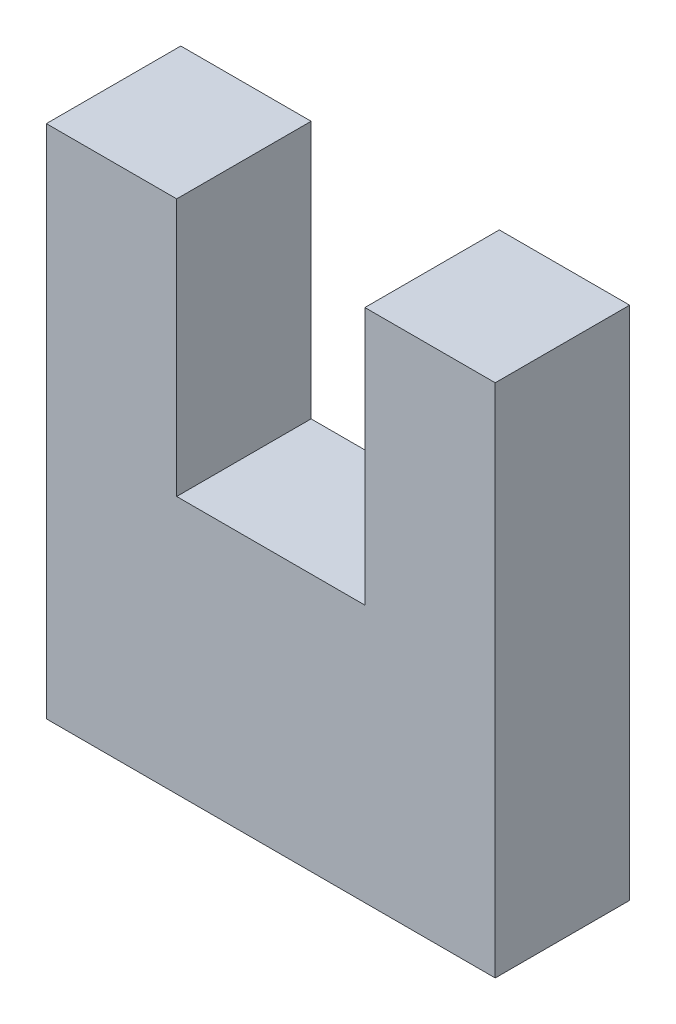
ISO-10303-21;
HEADER;
FILE_DESCRIPTION(('STEP AP214'),'2;1');
FILE_NAME('part.step','',(''),(''),'','','');
FILE_SCHEMA(('AUTOMOTIVE_DESIGN { 1 0 10303 214 1 1 1 1 }'));
ENDSEC;
DATA;
#1=APPLICATION_CONTEXT('core data for automotive mechanical design processes');
#2=APPLICATION_PROTOCOL_DEFINITION('international standard','automotive_design',2000,#1);
#3=PRODUCT_CONTEXT('',#1,'mechanical');
#4=PRODUCT('Part','Part','',(#3));
#5=PRODUCT_RELATED_PRODUCT_CATEGORY('part','',(#4));
#6=PRODUCT_DEFINITION_FORMATION('','',#4);
#7=PRODUCT_DEFINITION_CONTEXT('part definition',#1,'design');
#8=PRODUCT_DEFINITION('design','',#6,#7);
#9=PRODUCT_DEFINITION_SHAPE('','',#8);
#10=(LENGTH_UNIT() NAMED_UNIT(*) SI_UNIT(.MILLI.,.METRE.));
#11=(NAMED_UNIT(*) PLANE_ANGLE_UNIT() SI_UNIT($,.RADIAN.));
#12=(NAMED_UNIT(*) SI_UNIT($,.STERADIAN.) SOLID_ANGLE_UNIT());
#13=UNCERTAINTY_MEASURE_WITH_UNIT(LENGTH_MEASURE(1.E-05),#10,'distance_accuracy_value','');
#14=(GEOMETRIC_REPRESENTATION_CONTEXT(3) GLOBAL_UNCERTAINTY_ASSIGNED_CONTEXT((#13)) GLOBAL_UNIT_ASSIGNED_CONTEXT((#10,
#11,#12)) REPRESENTATION_CONTEXT('',''));
#15=CARTESIAN_POINT('',(0.,0.,0.));
#16=DIRECTION('',(0.,0.,1.));
#17=DIRECTION('',(1.,0.,0.));
#18=AXIS2_PLACEMENT_3D('',#15,#16,#17);
#19=CARTESIAN_POINT('',(0.,16.8021,0.));
#20=DIRECTION('',(0.,-1.,0.));
#21=DIRECTION('',(0.,0.,-1.));
#22=AXIS2_PLACEMENT_3D('',#19,#20,#21);
#23=PLANE('',#22);
#24=DIRECTION('',(0.,0.,1.));
#25=VECTOR('',#24,1.);
#26=CARTESIAN_POINT('',(20.7645,16.8021,-8.763));
#27=LINE('',#26,#25);
#28=CARTESIAN_POINT('',(20.7645,16.8021,-8.763));
#29=VERTEX_POINT('',#28);
#30=CARTESIAN_POINT('',(20.7645,16.8021,0.));
#31=VERTEX_POINT('',#30);
#32=EDGE_CURVE('E122',#29,#31,#27,.T.);
#33=ORIENTED_EDGE('',*,*,#32,.F.);
#34=DIRECTION('',(-1.,0.,0.));
#35=VECTOR('',#34,1.);
#36=CARTESIAN_POINT('',(0.,16.8021,-8.763));
#37=LINE('',#36,#35);
#38=CARTESIAN_POINT('',(8.49629999999999,16.8021,-8.763));
#39=VERTEX_POINT('',#38);
#40=EDGE_CURVE('E150',#29,#39,#37,.T.);
#41=ORIENTED_EDGE('',*,*,#40,.T.);
#42=DIRECTION('',(0.,0.,-1.));
#43=VECTOR('',#42,1.);
#44=CARTESIAN_POINT('',(8.49629999999999,16.8021,-8.763));
#45=LINE('',#44,#43);
#46=CARTESIAN_POINT('',(8.4963,16.8021,0.));
#47=VERTEX_POINT('',#46);
#48=EDGE_CURVE('E59',#47,#39,#45,.T.);
#49=ORIENTED_EDGE('',*,*,#48,.F.);
#50=DIRECTION('',(1.,0.,0.));
#51=VECTOR('',#50,1.);
#52=CARTESIAN_POINT('',(0.,16.8021,0.));
#53=LINE('',#52,#51);
#54=EDGE_CURVE('E54',#47,#31,#53,.T.);
#55=ORIENTED_EDGE('',*,*,#54,.T.);
#56=EDGE_LOOP('',(#33,#41,#49,#55));
#57=FACE_BOUND('',#56,.T.);
#58=ADVANCED_FACE('F39',(#57),#23,.F.);
#59=CARTESIAN_POINT('',(0.,16.8021,0.));
#60=DIRECTION('',(1.,0.,0.));
#61=DIRECTION('',(0.,0.,-1.));
#62=AXIS2_PLACEMENT_3D('',#59,#60,#61);
#63=PLANE('',#62);
#64=DIRECTION('',(0.,0.,1.));
#65=VECTOR('',#64,1.);
#66=CARTESIAN_POINT('',(0.,0.,0.));
#67=LINE('',#66,#65);
#68=CARTESIAN_POINT('',(0.,0.,-8.763));
#69=VERTEX_POINT('',#68);
#70=CARTESIAN_POINT('',(0.,0.,0.));
#71=VERTEX_POINT('',#70);
#72=EDGE_CURVE('E148',#69,#71,#67,.T.);
#73=ORIENTED_EDGE('',*,*,#72,.T.);
#74=DIRECTION('',(0.,-1.,0.));
#75=VECTOR('',#74,1.);
#76=CARTESIAN_POINT('',(0.,16.8021,0.));
#77=LINE('',#76,#75);
#78=CARTESIAN_POINT('',(0.,33.6042,0.));
#79=VERTEX_POINT('',#78);
#80=EDGE_CURVE('E11',#79,#71,#77,.T.);
#81=ORIENTED_EDGE('',*,*,#80,.F.);
#82=DIRECTION('',(0.,0.,1.));
#83=VECTOR('',#82,1.);
#84=CARTESIAN_POINT('',(0.,33.6042,-8.763));
#85=LINE('',#84,#83);
#86=CARTESIAN_POINT('',(0.,33.6042,-8.763));
#87=VERTEX_POINT('',#86);
#88=EDGE_CURVE('E137',#87,#79,#85,.T.);
#89=ORIENTED_EDGE('',*,*,#88,.F.);
#90=DIRECTION('',(0.,-1.,0.));
#91=VECTOR('',#90,1.);
#92=CARTESIAN_POINT('',(0.,16.8021,-8.763));
#93=LINE('',#92,#91);
#94=EDGE_CURVE('E153',#87,#69,#93,.T.);
#95=ORIENTED_EDGE('',*,*,#94,.T.);
#96=EDGE_LOOP('',(#73,#81,#89,#95));
#97=FACE_BOUND('',#96,.T.);
#98=ADVANCED_FACE('F41',(#97),#63,.F.);
#99=CARTESIAN_POINT('',(0.,16.8021,0.));
#100=DIRECTION('',(0.,0.,-1.));
#101=DIRECTION('',(-1.,0.,0.));
#102=AXIS2_PLACEMENT_3D('',#99,#100,#101);
#103=PLANE('',#102);
#104=DIRECTION('',(1.,0.,0.));
#105=VECTOR('',#104,1.);
#106=CARTESIAN_POINT('',(0.,0.,0.));
#107=LINE('',#106,#105);
#108=CARTESIAN_POINT('',(29.2608,0.,0.));
#109=VERTEX_POINT('',#108);
#110=EDGE_CURVE('E156',#71,#109,#107,.T.);
#111=ORIENTED_EDGE('',*,*,#110,.T.);
#112=DIRECTION('',(0.,-1.,0.));
#113=VECTOR('',#112,1.);
#114=CARTESIAN_POINT('',(29.2608,16.8021,0.));
#115=LINE('',#114,#113);
#116=CARTESIAN_POINT('',(29.2608,33.6042,0.));
#117=VERTEX_POINT('',#116);
#118=EDGE_CURVE('E47',#117,#109,#115,.T.);
#119=ORIENTED_EDGE('',*,*,#118,.F.);
#120=DIRECTION('',(1.,0.,0.));
#121=VECTOR('',#120,1.);
#122=CARTESIAN_POINT('',(29.2608,33.6042,0.));
#123=LINE('',#122,#121);
#124=CARTESIAN_POINT('',(20.7645,33.6042,0.));
#125=VERTEX_POINT('',#124);
#126=EDGE_CURVE('E102',#125,#117,#123,.T.);
#127=ORIENTED_EDGE('',*,*,#126,.F.);
#128=DIRECTION('',(0.,-1.,0.));
#129=VECTOR('',#128,1.);
#130=CARTESIAN_POINT('',(20.7645,33.6042,0.));
#131=LINE('',#130,#129);
#132=EDGE_CURVE('E106',#125,#31,#131,.T.);
#133=ORIENTED_EDGE('',*,*,#132,.T.);
#134=ORIENTED_EDGE('',*,*,#54,.F.);
#135=DIRECTION('',(0.,-1.,0.));
#136=VECTOR('',#135,1.);
#137=CARTESIAN_POINT('',(8.4963,33.6042,0.));
#138=LINE('',#137,#136);
#139=CARTESIAN_POINT('',(8.4963,33.6042,0.));
#140=VERTEX_POINT('',#139);
#141=EDGE_CURVE('E141',#140,#47,#138,.T.);
#142=ORIENTED_EDGE('',*,*,#141,.F.);
#143=DIRECTION('',(1.,0.,0.));
#144=VECTOR('',#143,1.);
#145=CARTESIAN_POINT('',(0.,33.6042,0.));
#146=LINE('',#145,#144);
#147=EDGE_CURVE('E140',#79,#140,#146,.T.);
#148=ORIENTED_EDGE('',*,*,#147,.F.);
#149=ORIENTED_EDGE('',*,*,#80,.T.);
#150=EDGE_LOOP('',(#111,#119,#127,#133,#134,#142,#148,#149));
#151=FACE_BOUND('',#150,.T.);
#152=ADVANCED_FACE('F104',(#151),#103,.F.);
#153=CARTESIAN_POINT('',(29.2608,16.8021,0.));
#154=DIRECTION('',(-1.,0.,0.));
#155=DIRECTION('',(0.,0.,1.));
#156=AXIS2_PLACEMENT_3D('',#153,#154,#155);
#157=PLANE('',#156);
#158=DIRECTION('',(0.,0.,-1.));
#159=VECTOR('',#158,1.);
#160=CARTESIAN_POINT('',(29.2608,0.,0.));
#161=LINE('',#160,#159);
#162=CARTESIAN_POINT('',(29.2608,0.,-8.763));
#163=VERTEX_POINT('',#162);
#164=EDGE_CURVE('E158',#109,#163,#161,.T.);
#165=ORIENTED_EDGE('',*,*,#164,.T.);
#166=DIRECTION('',(0.,-1.,0.));
#167=VECTOR('',#166,1.);
#168=CARTESIAN_POINT('',(29.2608,16.8021,-8.763));
#169=LINE('',#168,#167);
#170=CARTESIAN_POINT('',(29.2608,33.6042,-8.763));
#171=VERTEX_POINT('',#170);
#172=EDGE_CURVE('E163',#171,#163,#169,.T.);
#173=ORIENTED_EDGE('',*,*,#172,.F.);
#174=DIRECTION('',(0.,0.,-1.));
#175=VECTOR('',#174,1.);
#176=CARTESIAN_POINT('',(29.2608,33.6042,-8.763));
#177=LINE('',#176,#175);
#178=EDGE_CURVE('E112',#117,#171,#177,.T.);
#179=ORIENTED_EDGE('',*,*,#178,.F.);
#180=ORIENTED_EDGE('',*,*,#118,.T.);
#181=EDGE_LOOP('',(#165,#173,#179,#180));
#182=FACE_BOUND('',#181,.T.);
#183=ADVANCED_FACE('F167',(#182),#157,.F.);
#184=CARTESIAN_POINT('',(0.,16.8021,-8.763));
#185=DIRECTION('',(0.,0.,1.));
#186=DIRECTION('',(1.,0.,0.));
#187=AXIS2_PLACEMENT_3D('',#184,#185,#186);
#188=PLANE('',#187);
#189=DIRECTION('',(-1.,0.,0.));
#190=VECTOR('',#189,1.);
#191=CARTESIAN_POINT('',(0.,0.,-8.763));
#192=LINE('',#191,#190);
#193=EDGE_CURVE('E151',#163,#69,#192,.T.);
#194=ORIENTED_EDGE('',*,*,#193,.T.);
#195=ORIENTED_EDGE('',*,*,#94,.F.);
#196=DIRECTION('',(-1.,0.,0.));
#197=VECTOR('',#196,1.);
#198=CARTESIAN_POINT('',(0.,33.6042,-8.763));
#199=LINE('',#198,#197);
#200=CARTESIAN_POINT('',(8.49629999999999,33.6042,-8.763));
#201=VERTEX_POINT('',#200);
#202=EDGE_CURVE('E134',#201,#87,#199,.T.);
#203=ORIENTED_EDGE('',*,*,#202,.F.);
#204=DIRECTION('',(0.,-1.,0.));
#205=VECTOR('',#204,1.);
#206=CARTESIAN_POINT('',(8.49629999999999,33.6042,-8.763));
#207=LINE('',#206,#205);
#208=EDGE_CURVE('E145',#201,#39,#207,.T.);
#209=ORIENTED_EDGE('',*,*,#208,.T.);
#210=ORIENTED_EDGE('',*,*,#40,.F.);
#211=DIRECTION('',(0.,-1.,0.));
#212=VECTOR('',#211,1.);
#213=CARTESIAN_POINT('',(20.7645,33.6042,-8.763));
#214=LINE('',#213,#212);
#215=CARTESIAN_POINT('',(20.7645,33.6042,-8.763));
#216=VERTEX_POINT('',#215);
#217=EDGE_CURVE('E125',#216,#29,#214,.T.);
#218=ORIENTED_EDGE('',*,*,#217,.F.);
#219=DIRECTION('',(-1.,0.,0.));
#220=VECTOR('',#219,1.);
#221=CARTESIAN_POINT('',(29.2608,33.6042,-8.763));
#222=LINE('',#221,#220);
#223=EDGE_CURVE('E118',#171,#216,#222,.T.);
#224=ORIENTED_EDGE('',*,*,#223,.F.);
#225=ORIENTED_EDGE('',*,*,#172,.T.);
#226=EDGE_LOOP('',(#194,#195,#203,#209,#210,#218,#224,#225));
#227=FACE_BOUND('',#226,.T.);
#228=ADVANCED_FACE('F173',(#227),#188,.F.);
#229=CARTESIAN_POINT('',(0.,0.,0.));
#230=DIRECTION('',(0.,-1.,0.));
#231=DIRECTION('',(0.,0.,-1.));
#232=AXIS2_PLACEMENT_3D('',#229,#230,#231);
#233=PLANE('',#232);
#234=ORIENTED_EDGE('',*,*,#72,.F.);
#235=ORIENTED_EDGE('',*,*,#193,.F.);
#236=ORIENTED_EDGE('',*,*,#164,.F.);
#237=ORIENTED_EDGE('',*,*,#110,.F.);
#238=EDGE_LOOP('',(#234,#235,#236,#237));
#239=FACE_BOUND('',#238,.T.);
#240=ADVANCED_FACE('F171',(#239),#233,.T.);
#241=CARTESIAN_POINT('',(8.49629999999999,33.6042,-8.763));
#242=DIRECTION('',(-1.,0.,0.));
#243=DIRECTION('',(0.,0.,1.));
#244=AXIS2_PLACEMENT_3D('',#241,#242,#243);
#245=PLANE('',#244);
#246=ORIENTED_EDGE('',*,*,#48,.T.);
#247=ORIENTED_EDGE('',*,*,#208,.F.);
#248=DIRECTION('',(0.,0.,-1.));
#249=VECTOR('',#248,1.);
#250=CARTESIAN_POINT('',(8.49629999999999,33.6042,-8.763));
#251=LINE('',#250,#249);
#252=EDGE_CURVE('E127',#140,#201,#251,.T.);
#253=ORIENTED_EDGE('',*,*,#252,.F.);
#254=ORIENTED_EDGE('',*,*,#141,.T.);
#255=EDGE_LOOP('',(#246,#247,#253,#254));
#256=FACE_BOUND('',#255,.T.);
#257=ADVANCED_FACE('F183',(#256),#245,.F.);
#258=CARTESIAN_POINT('',(0.,33.6042,0.));
#259=DIRECTION('',(0.,1.,0.));
#260=DIRECTION('',(0.,0.,1.));
#261=AXIS2_PLACEMENT_3D('',#258,#259,#260);
#262=PLANE('',#261);
#263=ORIENTED_EDGE('',*,*,#252,.T.);
#264=ORIENTED_EDGE('',*,*,#202,.T.);
#265=ORIENTED_EDGE('',*,*,#88,.T.);
#266=ORIENTED_EDGE('',*,*,#147,.T.);
#267=EDGE_LOOP('',(#263,#264,#265,#266));
#268=FACE_BOUND('',#267,.T.);
#269=ADVANCED_FACE('F178',(#268),#262,.T.);
#270=CARTESIAN_POINT('',(20.7645,33.6042,-8.763));
#271=DIRECTION('',(1.,0.,0.));
#272=DIRECTION('',(0.,0.,-1.));
#273=AXIS2_PLACEMENT_3D('',#270,#271,#272);
#274=PLANE('',#273);
#275=ORIENTED_EDGE('',*,*,#32,.T.);
#276=ORIENTED_EDGE('',*,*,#132,.F.);
#277=DIRECTION('',(0.,0.,1.));
#278=VECTOR('',#277,1.);
#279=CARTESIAN_POINT('',(20.7645,33.6042,-8.763));
#280=LINE('',#279,#278);
#281=EDGE_CURVE('E113',#216,#125,#280,.T.);
#282=ORIENTED_EDGE('',*,*,#281,.F.);
#283=ORIENTED_EDGE('',*,*,#217,.T.);
#284=EDGE_LOOP('',(#275,#276,#282,#283));
#285=FACE_BOUND('',#284,.T.);
#286=ADVANCED_FACE('F124',(#285),#274,.F.);
#287=CARTESIAN_POINT('',(0.,33.6042,0.));
#288=DIRECTION('',(0.,-1.,0.));
#289=DIRECTION('',(0.,0.,-1.));
#290=AXIS2_PLACEMENT_3D('',#287,#288,#289);
#291=PLANE('',#290);
#292=ORIENTED_EDGE('',*,*,#281,.T.);
#293=ORIENTED_EDGE('',*,*,#126,.T.);
#294=ORIENTED_EDGE('',*,*,#178,.T.);
#295=ORIENTED_EDGE('',*,*,#223,.T.);
#296=EDGE_LOOP('',(#292,#293,#294,#295));
#297=FACE_BOUND('',#296,.T.);
#298=ADVANCED_FACE('F116',(#297),#291,.F.);
#299=CLOSED_SHELL('',(#58,#98,#152,#183,#228,#240,#257,#269,#286,#298));
#300=MANIFOLD_SOLID_BREP('B2',#299);
#301=ADVANCED_BREP_SHAPE_REPRESENTATION('',(#18,#300),#14);
#302=SHAPE_DEFINITION_REPRESENTATION(#9,#301);
ENDSEC;
END-ISO-10303-21;
